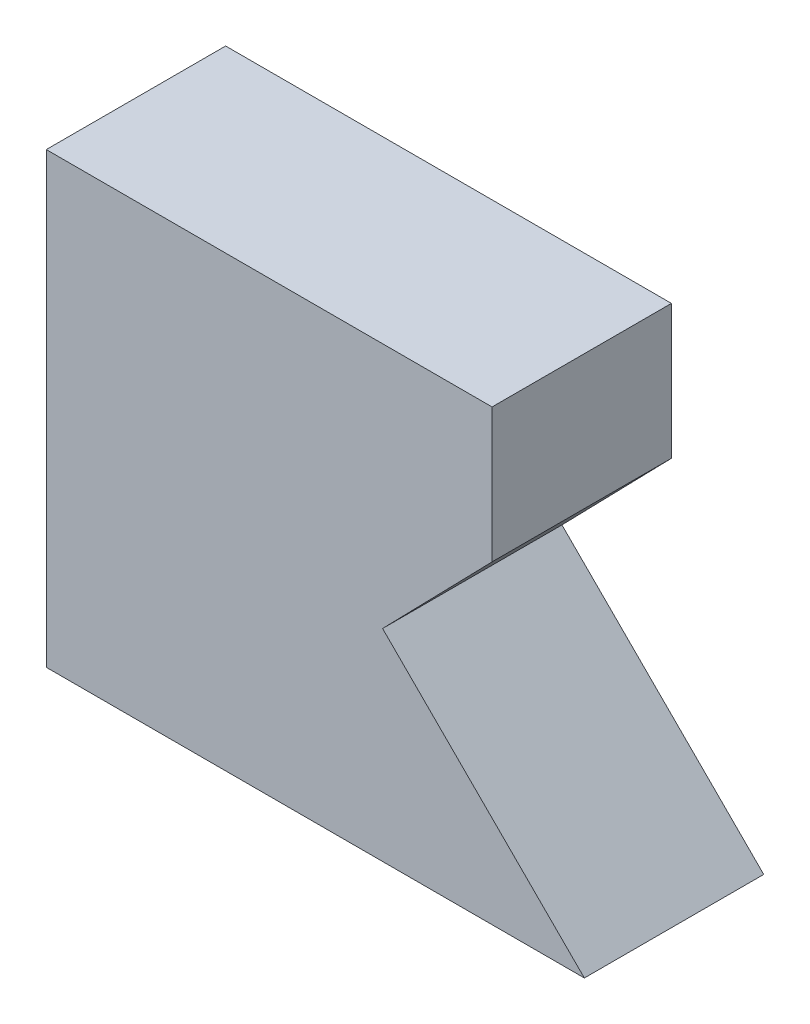
ISO-10303-21;
HEADER;
FILE_DESCRIPTION(('STEP AP214'),'2;1');
FILE_NAME('part.step','',(''),(''),'','','');
FILE_SCHEMA(('AUTOMOTIVE_DESIGN { 1 0 10303 214 1 1 1 1 }'));
ENDSEC;
DATA;
#1=APPLICATION_CONTEXT('core data for automotive mechanical design processes');
#2=APPLICATION_PROTOCOL_DEFINITION('international standard','automotive_design',2000,#1);
#3=PRODUCT_CONTEXT('',#1,'mechanical');
#4=PRODUCT('Part','Part','',(#3));
#5=PRODUCT_RELATED_PRODUCT_CATEGORY('part','',(#4));
#6=PRODUCT_DEFINITION_FORMATION('','',#4);
#7=PRODUCT_DEFINITION_CONTEXT('part definition',#1,'design');
#8=PRODUCT_DEFINITION('design','',#6,#7);
#9=PRODUCT_DEFINITION_SHAPE('','',#8);
#10=(LENGTH_UNIT() NAMED_UNIT(*) SI_UNIT(.MILLI.,.METRE.));
#11=(NAMED_UNIT(*) PLANE_ANGLE_UNIT() SI_UNIT($,.RADIAN.));
#12=(NAMED_UNIT(*) SI_UNIT($,.STERADIAN.) SOLID_ANGLE_UNIT());
#13=UNCERTAINTY_MEASURE_WITH_UNIT(LENGTH_MEASURE(1.E-05),#10,'distance_accuracy_value','');
#14=(GEOMETRIC_REPRESENTATION_CONTEXT(3) GLOBAL_UNCERTAINTY_ASSIGNED_CONTEXT((#13)) GLOBAL_UNIT_ASSIGNED_CONTEXT((#10,
#11,#12)) REPRESENTATION_CONTEXT('',''));
#15=CARTESIAN_POINT('',(0.,0.,0.));
#16=DIRECTION('',(0.,0.,1.));
#17=DIRECTION('',(1.,0.,0.));
#18=AXIS2_PLACEMENT_3D('',#15,#16,#17);
#19=CARTESIAN_POINT('',(39.4166574503962,70.0764199787357,40.));
#20=DIRECTION('',(-1.,0.,0.));
#21=DIRECTION('',(0.,0.,1.));
#22=AXIS2_PLACEMENT_3D('',#19,#20,#21);
#23=PLANE('',#22);
#24=DIRECTION('',(0.,1.,0.));
#25=VECTOR('',#24,1.);
#26=CARTESIAN_POINT('',(39.4166574503962,70.0764199787357,0.));
#27=LINE('',#26,#25);
#28=CARTESIAN_POINT('',(39.4166574503962,70.0764199787357,0.));
#29=VERTEX_POINT('',#28);
#30=CARTESIAN_POINT('',(39.4166574503962,100.,0.));
#31=VERTEX_POINT('',#30);
#32=EDGE_CURVE('E117',#29,#31,#27,.T.);
#33=ORIENTED_EDGE('',*,*,#32,.T.);
#34=DIRECTION('',(0.,0.,-1.));
#35=VECTOR('',#34,1.);
#36=CARTESIAN_POINT('',(39.4166574503962,100.,40.));
#37=LINE('',#36,#35);
#38=CARTESIAN_POINT('',(39.4166574503962,100.,40.));
#39=VERTEX_POINT('',#38);
#40=EDGE_CURVE('E11',#39,#31,#37,.T.);
#41=ORIENTED_EDGE('',*,*,#40,.F.);
#42=DIRECTION('',(0.,1.,0.));
#43=VECTOR('',#42,1.);
#44=CARTESIAN_POINT('',(39.4166574503962,70.0764199787357,40.));
#45=LINE('',#44,#43);
#46=CARTESIAN_POINT('',(39.4166574503962,70.0764199787357,40.));
#47=VERTEX_POINT('',#46);
#48=EDGE_CURVE('E127',#47,#39,#45,.T.);
#49=ORIENTED_EDGE('',*,*,#48,.F.);
#50=DIRECTION('',(0.,0.,-1.));
#51=VECTOR('',#50,1.);
#52=CARTESIAN_POINT('',(39.4166574503962,70.0764199787357,40.));
#53=LINE('',#52,#51);
#54=EDGE_CURVE('E113',#47,#29,#53,.T.);
#55=ORIENTED_EDGE('',*,*,#54,.T.);
#56=EDGE_LOOP('',(#33,#41,#49,#55));
#57=FACE_BOUND('',#56,.T.);
#58=ADVANCED_FACE('F33',(#57),#23,.F.);
#59=CARTESIAN_POINT('',(39.4166574503962,100.,40.));
#60=DIRECTION('',(0.,-1.,0.));
#61=DIRECTION('',(1.,0.,0.));
#62=AXIS2_PLACEMENT_3D('',#59,#60,#61);
#63=PLANE('',#62);
#64=DIRECTION('',(-1.,0.,0.));
#65=VECTOR('',#64,1.);
#66=CARTESIAN_POINT('',(39.4166574503962,100.,0.));
#67=LINE('',#66,#65);
#68=CARTESIAN_POINT('',(-60.,100.,0.));
#69=VERTEX_POINT('',#68);
#70=EDGE_CURVE('E120',#31,#69,#67,.T.);
#71=ORIENTED_EDGE('',*,*,#70,.T.);
#72=DIRECTION('',(0.,0.,-1.));
#73=VECTOR('',#72,1.);
#74=CARTESIAN_POINT('',(-60.,100.,40.));
#75=LINE('',#74,#73);
#76=CARTESIAN_POINT('',(-60.,100.,40.));
#77=VERTEX_POINT('',#76);
#78=EDGE_CURVE('E41',#77,#69,#75,.T.);
#79=ORIENTED_EDGE('',*,*,#78,.F.);
#80=DIRECTION('',(-1.,0.,0.));
#81=VECTOR('',#80,1.);
#82=CARTESIAN_POINT('',(39.4166574503962,100.,40.));
#83=LINE('',#82,#81);
#84=EDGE_CURVE('E86',#39,#77,#83,.T.);
#85=ORIENTED_EDGE('',*,*,#84,.F.);
#86=ORIENTED_EDGE('',*,*,#40,.T.);
#87=EDGE_LOOP('',(#71,#79,#85,#86));
#88=FACE_BOUND('',#87,.T.);
#89=ADVANCED_FACE('F151',(#88),#63,.F.);
#90=CARTESIAN_POINT('',(-60.,0.,40.));
#91=DIRECTION('',(1.,0.,0.));
#92=DIRECTION('',(0.,0.,-1.));
#93=AXIS2_PLACEMENT_3D('',#90,#91,#92);
#94=PLANE('',#93);
#95=DIRECTION('',(0.,-1.,0.));
#96=VECTOR('',#95,1.);
#97=CARTESIAN_POINT('',(-60.,0.,0.));
#98=LINE('',#97,#96);
#99=CARTESIAN_POINT('',(-60.,0.,0.));
#100=VERTEX_POINT('',#99);
#101=EDGE_CURVE('E122',#69,#100,#98,.T.);
#102=ORIENTED_EDGE('',*,*,#101,.T.);
#103=DIRECTION('',(0.,0.,-1.));
#104=VECTOR('',#103,1.);
#105=CARTESIAN_POINT('',(-60.,0.,40.));
#106=LINE('',#105,#104);
#107=CARTESIAN_POINT('',(-60.,0.,40.));
#108=VERTEX_POINT('',#107);
#109=EDGE_CURVE('E108',#108,#100,#106,.T.);
#110=ORIENTED_EDGE('',*,*,#109,.F.);
#111=DIRECTION('',(0.,-1.,0.));
#112=VECTOR('',#111,1.);
#113=CARTESIAN_POINT('',(-60.,0.,40.));
#114=LINE('',#113,#112);
#115=EDGE_CURVE('E99',#77,#108,#114,.T.);
#116=ORIENTED_EDGE('',*,*,#115,.F.);
#117=ORIENTED_EDGE('',*,*,#78,.T.);
#118=EDGE_LOOP('',(#102,#110,#116,#117));
#119=FACE_BOUND('',#118,.T.);
#120=ADVANCED_FACE('F133',(#119),#94,.F.);
#121=CARTESIAN_POINT('',(-60.,0.,40.));
#122=DIRECTION('',(0.,1.,0.));
#123=DIRECTION('',(0.,0.,1.));
#124=AXIS2_PLACEMENT_3D('',#121,#122,#123);
#125=PLANE('',#124);
#126=DIRECTION('',(1.,0.,0.));
#127=VECTOR('',#126,1.);
#128=CARTESIAN_POINT('',(-60.,0.,0.));
#129=LINE('',#128,#127);
#130=CARTESIAN_POINT('',(60.,0.,0.));
#131=VERTEX_POINT('',#130);
#132=EDGE_CURVE('E107',#100,#131,#129,.T.);
#133=ORIENTED_EDGE('',*,*,#132,.T.);
#134=DIRECTION('',(0.,0.,-1.));
#135=VECTOR('',#134,1.);
#136=CARTESIAN_POINT('',(60.,0.,40.));
#137=LINE('',#136,#135);
#138=CARTESIAN_POINT('',(60.,0.,40.));
#139=VERTEX_POINT('',#138);
#140=EDGE_CURVE('E104',#139,#131,#137,.T.);
#141=ORIENTED_EDGE('',*,*,#140,.F.);
#142=DIRECTION('',(1.,0.,0.));
#143=VECTOR('',#142,1.);
#144=CARTESIAN_POINT('',(-60.,0.,40.));
#145=LINE('',#144,#143);
#146=EDGE_CURVE('E93',#108,#139,#145,.T.);
#147=ORIENTED_EDGE('',*,*,#146,.F.);
#148=ORIENTED_EDGE('',*,*,#109,.T.);
#149=EDGE_LOOP('',(#133,#141,#147,#148));
#150=FACE_BOUND('',#149,.T.);
#151=ADVANCED_FACE('F105',(#150),#125,.F.);
#152=CARTESIAN_POINT('',(60.,0.,40.));
#153=DIRECTION('',(-0.707106781186549,-0.707106781186546,0.));
#154=DIRECTION('',(0.707106781186546,-0.707106781186549,0.));
#155=AXIS2_PLACEMENT_3D('',#152,#153,#154);
#156=PLANE('',#155);
#157=DIRECTION('',(-0.707106781186546,0.707106781186549,0.));
#158=VECTOR('',#157,1.);
#159=CARTESIAN_POINT('',(60.,0.,0.));
#160=LINE('',#159,#158);
#161=CARTESIAN_POINT('',(15.0000000000632,44.999999999937,0.));
#162=VERTEX_POINT('',#161);
#163=EDGE_CURVE('E72',#131,#162,#160,.T.);
#164=ORIENTED_EDGE('',*,*,#163,.T.);
#165=DIRECTION('',(0.,0.,-1.));
#166=VECTOR('',#165,1.);
#167=CARTESIAN_POINT('',(15.0000000000632,44.999999999937,40.));
#168=LINE('',#167,#166);
#169=CARTESIAN_POINT('',(15.0000000000632,44.999999999937,40.));
#170=VERTEX_POINT('',#169);
#171=EDGE_CURVE('E109',#170,#162,#168,.T.);
#172=ORIENTED_EDGE('',*,*,#171,.F.);
#173=DIRECTION('',(-0.707106781186546,0.707106781186549,0.));
#174=VECTOR('',#173,1.);
#175=CARTESIAN_POINT('',(60.,0.,40.));
#176=LINE('',#175,#174);
#177=EDGE_CURVE('E97',#139,#170,#176,.T.);
#178=ORIENTED_EDGE('',*,*,#177,.F.);
#179=ORIENTED_EDGE('',*,*,#140,.T.);
#180=EDGE_LOOP('',(#164,#172,#178,#179));
#181=FACE_BOUND('',#180,.T.);
#182=ADVANCED_FACE('F111',(#181),#156,.F.);
#183=CARTESIAN_POINT('',(15.0000000000632,44.999999999937,40.));
#184=DIRECTION('',(-0.716469142251393,0.697618784295229,0.));
#185=DIRECTION('',(-0.697618784295229,-0.716469142251393,0.));
#186=AXIS2_PLACEMENT_3D('',#183,#184,#185);
#187=PLANE('',#186);
#188=DIRECTION('',(0.697618784295229,0.716469142251393,0.));
#189=VECTOR('',#188,1.);
#190=CARTESIAN_POINT('',(15.0000000000632,44.999999999937,0.));
#191=LINE('',#190,#189);
#192=EDGE_CURVE('E78',#162,#29,#191,.T.);
#193=ORIENTED_EDGE('',*,*,#192,.T.);
#194=ORIENTED_EDGE('',*,*,#54,.F.);
#195=DIRECTION('',(0.697618784295229,0.716469142251393,0.));
#196=VECTOR('',#195,1.);
#197=CARTESIAN_POINT('',(15.0000000000632,44.999999999937,40.));
#198=LINE('',#197,#196);
#199=EDGE_CURVE('E49',#170,#47,#198,.T.);
#200=ORIENTED_EDGE('',*,*,#199,.F.);
#201=ORIENTED_EDGE('',*,*,#171,.T.);
#202=EDGE_LOOP('',(#193,#194,#200,#201));
#203=FACE_BOUND('',#202,.T.);
#204=ADVANCED_FACE('F140',(#203),#187,.F.);
#205=CARTESIAN_POINT('',(0.,0.,40.));
#206=DIRECTION('',(0.,0.,1.));
#207=DIRECTION('',(1.,0.,0.));
#208=AXIS2_PLACEMENT_3D('',#205,#206,#207);
#209=PLANE('',#208);
#210=ORIENTED_EDGE('',*,*,#48,.T.);
#211=ORIENTED_EDGE('',*,*,#84,.T.);
#212=ORIENTED_EDGE('',*,*,#115,.T.);
#213=ORIENTED_EDGE('',*,*,#146,.T.);
#214=ORIENTED_EDGE('',*,*,#177,.T.);
#215=ORIENTED_EDGE('',*,*,#199,.T.);
#216=EDGE_LOOP('',(#210,#211,#212,#213,#214,#215));
#217=FACE_BOUND('',#216,.T.);
#218=ADVANCED_FACE('F95',(#217),#209,.T.);
#219=CARTESIAN_POINT('',(0.,0.,0.));
#220=DIRECTION('',(0.,0.,1.));
#221=DIRECTION('',(1.,0.,0.));
#222=AXIS2_PLACEMENT_3D('',#219,#220,#221);
#223=PLANE('',#222);
#224=ORIENTED_EDGE('',*,*,#32,.F.);
#225=ORIENTED_EDGE('',*,*,#192,.F.);
#226=ORIENTED_EDGE('',*,*,#163,.F.);
#227=ORIENTED_EDGE('',*,*,#132,.F.);
#228=ORIENTED_EDGE('',*,*,#101,.F.);
#229=ORIENTED_EDGE('',*,*,#70,.F.);
#230=EDGE_LOOP('',(#224,#225,#226,#227,#228,#229));
#231=FACE_BOUND('',#230,.T.);
#232=ADVANCED_FACE('F136',(#231),#223,.F.);
#233=CLOSED_SHELL('',(#58,#89,#120,#151,#182,#204,#218,#232));
#234=MANIFOLD_SOLID_BREP('B2',#233);
#235=ADVANCED_BREP_SHAPE_REPRESENTATION('',(#18,#234),#14);
#236=SHAPE_DEFINITION_REPRESENTATION(#9,#235);
ENDSEC;
END-ISO-10303-21;
